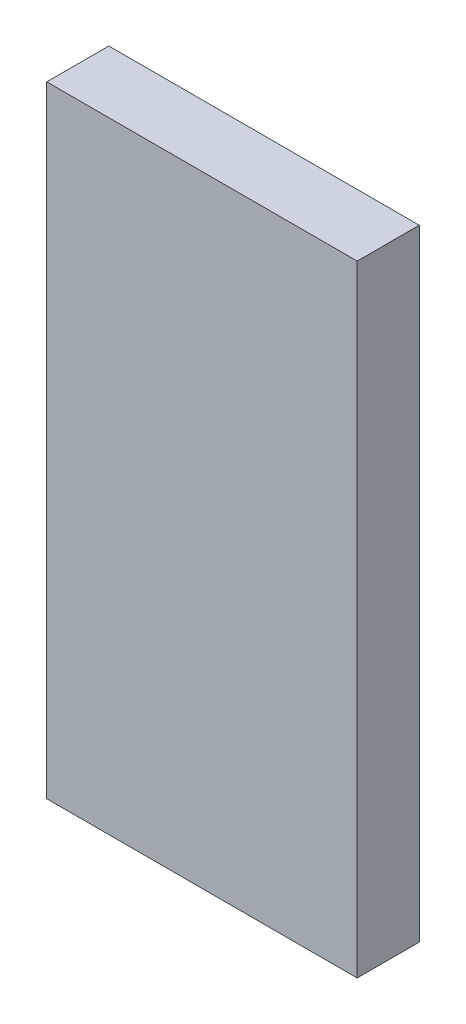
ISO-10303-21;
HEADER;
FILE_DESCRIPTION(('STEP AP214'),'2;1');
FILE_NAME('part.step','',(''),(''),'','','');
FILE_SCHEMA(('AUTOMOTIVE_DESIGN { 1 0 10303 214 1 1 1 1 }'));
ENDSEC;
DATA;
#1=APPLICATION_CONTEXT('core data for automotive mechanical design processes');
#2=APPLICATION_PROTOCOL_DEFINITION('international standard','automotive_design',2000,#1);
#3=PRODUCT_CONTEXT('',#1,'mechanical');
#4=PRODUCT('Part','Part','',(#3));
#5=PRODUCT_RELATED_PRODUCT_CATEGORY('part','',(#4));
#6=PRODUCT_DEFINITION_FORMATION('','',#4);
#7=PRODUCT_DEFINITION_CONTEXT('part definition',#1,'design');
#8=PRODUCT_DEFINITION('design','',#6,#7);
#9=PRODUCT_DEFINITION_SHAPE('','',#8);
#10=(LENGTH_UNIT() NAMED_UNIT(*) SI_UNIT(.MILLI.,.METRE.));
#11=(NAMED_UNIT(*) PLANE_ANGLE_UNIT() SI_UNIT($,.RADIAN.));
#12=(NAMED_UNIT(*) SI_UNIT($,.STERADIAN.) SOLID_ANGLE_UNIT());
#13=UNCERTAINTY_MEASURE_WITH_UNIT(LENGTH_MEASURE(1.E-05),#10,'distance_accuracy_value','');
#14=(GEOMETRIC_REPRESENTATION_CONTEXT(3) GLOBAL_UNCERTAINTY_ASSIGNED_CONTEXT((#13)) GLOBAL_UNIT_ASSIGNED_CONTEXT((#10,
#11,#12)) REPRESENTATION_CONTEXT('',''));
#15=CARTESIAN_POINT('',(0.,0.,0.));
#16=DIRECTION('',(0.,0.,1.));
#17=DIRECTION('',(1.,0.,0.));
#18=AXIS2_PLACEMENT_3D('',#15,#16,#17);
#19=CARTESIAN_POINT('',(0.,0.,12.));
#20=DIRECTION('',(1.,0.,0.));
#21=DIRECTION('',(0.,0.,-1.));
#22=AXIS2_PLACEMENT_3D('',#19,#20,#21);
#23=PLANE('',#22);
#24=DIRECTION('',(0.,-1.,0.));
#25=VECTOR('',#24,1.);
#26=CARTESIAN_POINT('',(0.,0.,0.));
#27=LINE('',#26,#25);
#28=CARTESIAN_POINT('',(0.,120.,0.));
#29=VERTEX_POINT('',#28);
#30=CARTESIAN_POINT('',(0.,0.,0.));
#31=VERTEX_POINT('',#30);
#32=EDGE_CURVE('E96',#29,#31,#27,.T.);
#33=ORIENTED_EDGE('',*,*,#32,.T.);
#34=DIRECTION('',(0.,0.,-1.));
#35=VECTOR('',#34,1.);
#36=CARTESIAN_POINT('',(0.,0.,12.));
#37=LINE('',#36,#35);
#38=CARTESIAN_POINT('',(0.,0.,12.));
#39=VERTEX_POINT('',#38);
#40=EDGE_CURVE('E11',#39,#31,#37,.T.);
#41=ORIENTED_EDGE('',*,*,#40,.F.);
#42=DIRECTION('',(0.,-1.,0.));
#43=VECTOR('',#42,1.);
#44=CARTESIAN_POINT('',(0.,0.,12.));
#45=LINE('',#44,#43);
#46=CARTESIAN_POINT('',(0.,120.,12.));
#47=VERTEX_POINT('',#46);
#48=EDGE_CURVE('E84',#47,#39,#45,.T.);
#49=ORIENTED_EDGE('',*,*,#48,.F.);
#50=DIRECTION('',(0.,0.,-1.));
#51=VECTOR('',#50,1.);
#52=CARTESIAN_POINT('',(0.,120.,12.));
#53=LINE('',#52,#51);
#54=EDGE_CURVE('E92',#47,#29,#53,.T.);
#55=ORIENTED_EDGE('',*,*,#54,.T.);
#56=EDGE_LOOP('',(#33,#41,#49,#55));
#57=FACE_BOUND('',#56,.T.);
#58=ADVANCED_FACE('F33',(#57),#23,.F.);
#59=CARTESIAN_POINT('',(0.,0.,12.));
#60=DIRECTION('',(0.,1.,0.));
#61=DIRECTION('',(0.,0.,1.));
#62=AXIS2_PLACEMENT_3D('',#59,#60,#61);
#63=PLANE('',#62);
#64=DIRECTION('',(1.,0.,0.));
#65=VECTOR('',#64,1.);
#66=CARTESIAN_POINT('',(0.,0.,0.));
#67=LINE('',#66,#65);
#68=CARTESIAN_POINT('',(60.,0.,0.));
#69=VERTEX_POINT('',#68);
#70=EDGE_CURVE('E88',#31,#69,#67,.T.);
#71=ORIENTED_EDGE('',*,*,#70,.T.);
#72=DIRECTION('',(0.,0.,-1.));
#73=VECTOR('',#72,1.);
#74=CARTESIAN_POINT('',(60.,0.,12.));
#75=LINE('',#74,#73);
#76=CARTESIAN_POINT('',(60.,0.,12.));
#77=VERTEX_POINT('',#76);
#78=EDGE_CURVE('E41',#77,#69,#75,.T.);
#79=ORIENTED_EDGE('',*,*,#78,.F.);
#80=DIRECTION('',(1.,0.,0.));
#81=VECTOR('',#80,1.);
#82=CARTESIAN_POINT('',(0.,0.,12.));
#83=LINE('',#82,#81);
#84=EDGE_CURVE('E79',#39,#77,#83,.T.);
#85=ORIENTED_EDGE('',*,*,#84,.F.);
#86=ORIENTED_EDGE('',*,*,#40,.T.);
#87=EDGE_LOOP('',(#71,#79,#85,#86));
#88=FACE_BOUND('',#87,.T.);
#89=ADVANCED_FACE('F87',(#88),#63,.F.);
#90=CARTESIAN_POINT('',(60.,0.,12.));
#91=DIRECTION('',(-1.,0.,0.));
#92=DIRECTION('',(0.,0.,1.));
#93=AXIS2_PLACEMENT_3D('',#90,#91,#92);
#94=PLANE('',#93);
#95=DIRECTION('',(0.,1.,0.));
#96=VECTOR('',#95,1.);
#97=CARTESIAN_POINT('',(60.,0.,0.));
#98=LINE('',#97,#96);
#99=CARTESIAN_POINT('',(60.,120.,0.));
#100=VERTEX_POINT('',#99);
#101=EDGE_CURVE('E66',#69,#100,#98,.T.);
#102=ORIENTED_EDGE('',*,*,#101,.T.);
#103=DIRECTION('',(0.,0.,-1.));
#104=VECTOR('',#103,1.);
#105=CARTESIAN_POINT('',(60.,120.,12.));
#106=LINE('',#105,#104);
#107=CARTESIAN_POINT('',(60.,120.,12.));
#108=VERTEX_POINT('',#107);
#109=EDGE_CURVE('E89',#108,#100,#106,.T.);
#110=ORIENTED_EDGE('',*,*,#109,.F.);
#111=DIRECTION('',(0.,1.,0.));
#112=VECTOR('',#111,1.);
#113=CARTESIAN_POINT('',(60.,0.,12.));
#114=LINE('',#113,#112);
#115=EDGE_CURVE('E82',#77,#108,#114,.T.);
#116=ORIENTED_EDGE('',*,*,#115,.F.);
#117=ORIENTED_EDGE('',*,*,#78,.T.);
#118=EDGE_LOOP('',(#102,#110,#116,#117));
#119=FACE_BOUND('',#118,.T.);
#120=ADVANCED_FACE('F90',(#119),#94,.F.);
#121=CARTESIAN_POINT('',(0.,120.,12.));
#122=DIRECTION('',(0.,-1.,0.));
#123=DIRECTION('',(0.,0.,-1.));
#124=AXIS2_PLACEMENT_3D('',#121,#122,#123);
#125=PLANE('',#124);
#126=DIRECTION('',(-1.,0.,0.));
#127=VECTOR('',#126,1.);
#128=CARTESIAN_POINT('',(0.,120.,0.));
#129=LINE('',#128,#127);
#130=EDGE_CURVE('E72',#100,#29,#129,.T.);
#131=ORIENTED_EDGE('',*,*,#130,.T.);
#132=ORIENTED_EDGE('',*,*,#54,.F.);
#133=DIRECTION('',(-1.,0.,0.));
#134=VECTOR('',#133,1.);
#135=CARTESIAN_POINT('',(0.,120.,12.));
#136=LINE('',#135,#134);
#137=EDGE_CURVE('E49',#108,#47,#136,.T.);
#138=ORIENTED_EDGE('',*,*,#137,.F.);
#139=ORIENTED_EDGE('',*,*,#109,.T.);
#140=EDGE_LOOP('',(#131,#132,#138,#139));
#141=FACE_BOUND('',#140,.T.);
#142=ADVANCED_FACE('F103',(#141),#125,.F.);
#143=CARTESIAN_POINT('',(0.,0.,12.));
#144=DIRECTION('',(0.,0.,-1.));
#145=DIRECTION('',(-1.,0.,0.));
#146=AXIS2_PLACEMENT_3D('',#143,#144,#145);
#147=PLANE('',#146);
#148=ORIENTED_EDGE('',*,*,#48,.T.);
#149=ORIENTED_EDGE('',*,*,#84,.T.);
#150=ORIENTED_EDGE('',*,*,#115,.T.);
#151=ORIENTED_EDGE('',*,*,#137,.T.);
#152=EDGE_LOOP('',(#148,#149,#150,#151));
#153=FACE_BOUND('',#152,.T.);
#154=ADVANCED_FACE('F80',(#153),#147,.F.);
#155=CARTESIAN_POINT('',(0.,0.,0.));
#156=DIRECTION('',(0.,0.,-1.));
#157=DIRECTION('',(-1.,0.,0.));
#158=AXIS2_PLACEMENT_3D('',#155,#156,#157);
#159=PLANE('',#158);
#160=ORIENTED_EDGE('',*,*,#32,.F.);
#161=ORIENTED_EDGE('',*,*,#130,.F.);
#162=ORIENTED_EDGE('',*,*,#101,.F.);
#163=ORIENTED_EDGE('',*,*,#70,.F.);
#164=EDGE_LOOP('',(#160,#161,#162,#163));
#165=FACE_BOUND('',#164,.T.);
#166=ADVANCED_FACE('F106',(#165),#159,.T.);
#167=CLOSED_SHELL('',(#58,#89,#120,#142,#154,#166));
#168=MANIFOLD_SOLID_BREP('B2',#167);
#169=ADVANCED_BREP_SHAPE_REPRESENTATION('',(#18,#168),#14);
#170=SHAPE_DEFINITION_REPRESENTATION(#9,#169);
ENDSEC;
END-ISO-10303-21;
